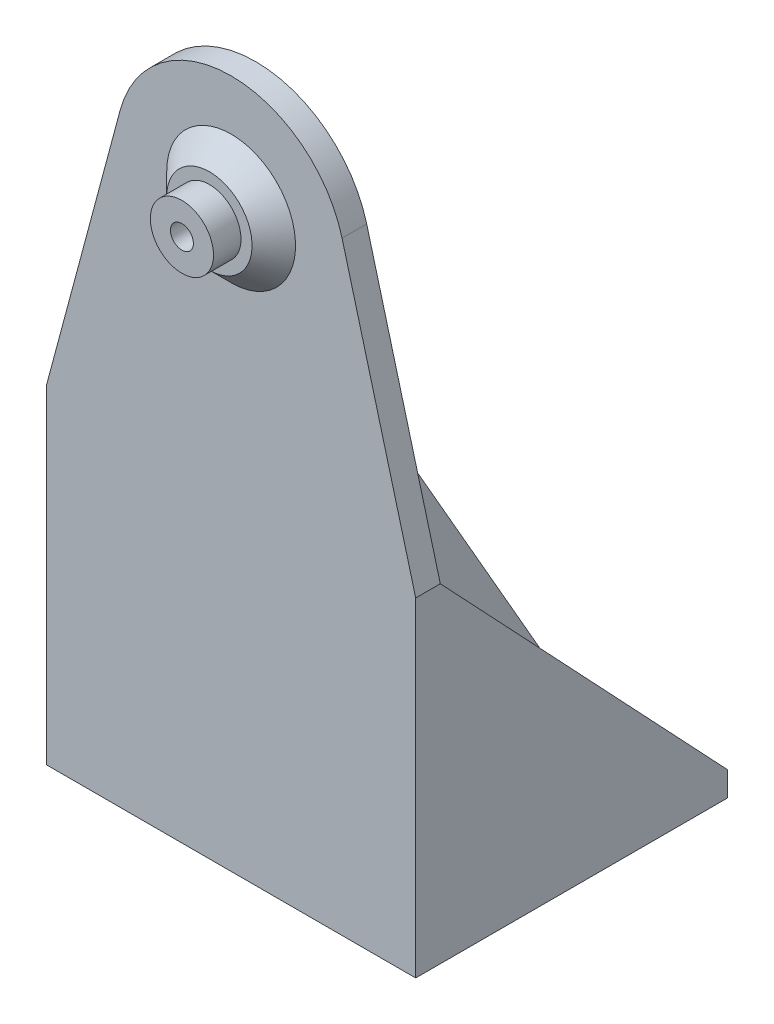
ISO-10303-21;
HEADER;
FILE_DESCRIPTION(('STEP AP214'),'2;1');
FILE_NAME('part.step','',(''),(''),'','','');
FILE_SCHEMA(('AUTOMOTIVE_DESIGN { 1 0 10303 214 1 1 1 1 }'));
ENDSEC;
DATA;
#1=APPLICATION_CONTEXT('core data for automotive mechanical design processes');
#2=APPLICATION_PROTOCOL_DEFINITION('international standard','automotive_design',2000,#1);
#3=PRODUCT_CONTEXT('',#1,'mechanical');
#4=PRODUCT('Part','Part','',(#3));
#5=PRODUCT_RELATED_PRODUCT_CATEGORY('part','',(#4));
#6=PRODUCT_DEFINITION_FORMATION('','',#4);
#7=PRODUCT_DEFINITION_CONTEXT('part definition',#1,'design');
#8=PRODUCT_DEFINITION('design','',#6,#7);
#9=PRODUCT_DEFINITION_SHAPE('','',#8);
#10=(LENGTH_UNIT() NAMED_UNIT(*) SI_UNIT(.MILLI.,.METRE.));
#11=(NAMED_UNIT(*) PLANE_ANGLE_UNIT() SI_UNIT($,.RADIAN.));
#12=(NAMED_UNIT(*) SI_UNIT($,.STERADIAN.) SOLID_ANGLE_UNIT());
#13=UNCERTAINTY_MEASURE_WITH_UNIT(LENGTH_MEASURE(1.E-05),#10,'distance_accuracy_value','');
#14=(GEOMETRIC_REPRESENTATION_CONTEXT(3) GLOBAL_UNCERTAINTY_ASSIGNED_CONTEXT((#13)) GLOBAL_UNIT_ASSIGNED_CONTEXT((#10,
#11,#12)) REPRESENTATION_CONTEXT('',''));
#15=CARTESIAN_POINT('',(0.,0.,0.));
#16=DIRECTION('',(0.,0.,1.));
#17=DIRECTION('',(1.,0.,0.));
#18=AXIS2_PLACEMENT_3D('',#15,#16,#17);
#19=CARTESIAN_POINT('',(22.4988060522023,-66.9948410242697,-44.));
#20=DIRECTION('',(0.,-1.,0.));
#21=DIRECTION('',(0.,0.,-1.));
#22=AXIS2_PLACEMENT_3D('',#19,#20,#21);
#23=PLANE('',#22);
#24=DIRECTION('',(0.,0.,1.));
#25=VECTOR('',#24,1.);
#26=CARTESIAN_POINT('',(14.0796860522023,-66.9948410242697,0.));
#27=LINE('',#26,#25);
#28=CARTESIAN_POINT('',(14.0796860522023,-66.9948410242697,-35.));
#29=VERTEX_POINT('',#28);
#30=CARTESIAN_POINT('',(14.0796860522023,-66.9948410242697,-19.));
#31=VERTEX_POINT('',#30);
#32=EDGE_CURVE('E253',#29,#31,#27,.T.);
#33=ORIENTED_EDGE('',*,*,#32,.T.);
#34=CARTESIAN_POINT('',(12.4813860522023,-66.9948410242697,-19.));
#35=DIRECTION('',(0.,1.,0.));
#36=DIRECTION('',(0.,0.,1.));
#37=AXIS2_PLACEMENT_3D('',#34,#35,#36);
#38=CIRCLE('',#37,1.5983);
#39=CARTESIAN_POINT('',(10.8830860522023,-66.9948410242697,-19.));
#40=VERTEX_POINT('',#39);
#41=EDGE_CURVE('E263',#40,#31,#38,.T.);
#42=ORIENTED_EDGE('',*,*,#41,.F.);
#43=DIRECTION('',(0.,0.,1.));
#44=VECTOR('',#43,1.);
#45=CARTESIAN_POINT('',(10.8830860522023,-66.9948410242697,0.));
#46=LINE('',#45,#44);
#47=CARTESIAN_POINT('',(10.8830860522023,-66.9948410242697,-35.));
#48=VERTEX_POINT('',#47);
#49=EDGE_CURVE('E260',#48,#40,#46,.T.);
#50=ORIENTED_EDGE('',*,*,#49,.F.);
#51=CARTESIAN_POINT('',(12.4813860522023,-66.9948410242697,-35.));
#52=DIRECTION('',(0.,1.,0.));
#53=DIRECTION('',(0.,0.,1.));
#54=AXIS2_PLACEMENT_3D('',#51,#52,#53);
#55=CIRCLE('',#54,1.5983);
#56=EDGE_CURVE('E256',#29,#48,#55,.T.);
#57=ORIENTED_EDGE('',*,*,#56,.F.);
#58=EDGE_LOOP('',(#33,#42,#50,#57));
#59=FACE_BOUND('',#58,.T.);
#60=DIRECTION('',(0.,0.,-1.));
#61=VECTOR('',#60,1.);
#62=CARTESIAN_POINT('',(1.49999999999999,-66.9948410242697,-9.));
#63=LINE('',#62,#61);
#64=CARTESIAN_POINT('',(1.49999999999999,-66.9948410242697,-9.));
#65=VERTEX_POINT('',#64);
#66=CARTESIAN_POINT('',(1.5,-66.9948410242697,-44.));
#67=VERTEX_POINT('',#66);
#68=EDGE_CURVE('E68',#65,#67,#63,.T.);
#69=ORIENTED_EDGE('',*,*,#68,.F.);
#70=DIRECTION('',(1.,0.,0.));
#71=VECTOR('',#70,1.);
#72=CARTESIAN_POINT('',(22.4988060522023,-66.9948410242697,-9.));
#73=LINE('',#72,#71);
#74=CARTESIAN_POINT('',(19.4988060522023,-66.9948410242697,-9.));
#75=VERTEX_POINT('',#74);
#76=EDGE_CURVE('E215',#65,#75,#73,.T.);
#77=ORIENTED_EDGE('',*,*,#76,.T.);
#78=DIRECTION('',(0.,0.,1.));
#79=VECTOR('',#78,1.);
#80=CARTESIAN_POINT('',(19.4988060522023,-66.9948410242697,-44.));
#81=LINE('',#80,#79);
#82=CARTESIAN_POINT('',(19.4988060522023,-66.9948410242697,-44.));
#83=VERTEX_POINT('',#82);
#84=EDGE_CURVE('E249',#83,#75,#81,.T.);
#85=ORIENTED_EDGE('',*,*,#84,.F.);
#86=DIRECTION('',(1.,0.,0.));
#87=VECTOR('',#86,1.);
#88=CARTESIAN_POINT('',(22.4988060522023,-66.9948410242697,-44.));
#89=LINE('',#88,#87);
#90=EDGE_CURVE('E324',#67,#83,#89,.T.);
#91=ORIENTED_EDGE('',*,*,#90,.F.);
#92=EDGE_LOOP('',(#69,#77,#85,#91));
#93=FACE_BOUND('',#92,.T.);
#94=ADVANCED_FACE('F53',(#59,#93),#23,.F.);
#95=CARTESIAN_POINT('',(-12.4813860522023,-66.9948410242697,-19.));
#96=DIRECTION('',(0.,1.,0.));
#97=DIRECTION('',(0.,0.,1.));
#98=AXIS2_PLACEMENT_3D('',#95,#96,#97);
#99=CIRCLE('',#98,1.5983);
#100=CARTESIAN_POINT('',(-10.8830860522023,-66.9948410242697,-19.));
#101=VERTEX_POINT('',#100);
#102=CARTESIAN_POINT('',(-14.0796860522023,-66.9948410242697,-19.));
#103=VERTEX_POINT('',#102);
#104=EDGE_CURVE('E252',#101,#103,#99,.F.);
#105=ORIENTED_EDGE('',*,*,#104,.T.);
#106=DIRECTION('',(0.,0.,1.));
#107=VECTOR('',#106,1.);
#108=CARTESIAN_POINT('',(-14.0796860522023,-66.9948410242697,0.));
#109=LINE('',#108,#107);
#110=CARTESIAN_POINT('',(-14.0796860522023,-66.9948410242697,-35.));
#111=VERTEX_POINT('',#110);
#112=EDGE_CURVE('E284',#111,#103,#109,.T.);
#113=ORIENTED_EDGE('',*,*,#112,.F.);
#114=CARTESIAN_POINT('',(-12.4813860522023,-66.9948410242697,-35.));
#115=DIRECTION('',(0.,1.,0.));
#116=DIRECTION('',(0.,0.,1.));
#117=AXIS2_PLACEMENT_3D('',#114,#115,#116);
#118=CIRCLE('',#117,1.5983);
#119=CARTESIAN_POINT('',(-10.8830860522023,-66.9948410242697,-35.));
#120=VERTEX_POINT('',#119);
#121=EDGE_CURVE('E281',#111,#120,#118,.F.);
#122=ORIENTED_EDGE('',*,*,#121,.T.);
#123=DIRECTION('',(0.,0.,1.));
#124=VECTOR('',#123,1.);
#125=CARTESIAN_POINT('',(-10.8830860522023,-66.9948410242697,0.));
#126=LINE('',#125,#124);
#127=EDGE_CURVE('E278',#120,#101,#126,.T.);
#128=ORIENTED_EDGE('',*,*,#127,.T.);
#129=EDGE_LOOP('',(#105,#113,#122,#128));
#130=FACE_BOUND('',#129,.T.);
#131=CARTESIAN_POINT('',(-19.4988060522023,-66.9948410242697,-9.));
#132=VERTEX_POINT('',#131);
#133=CARTESIAN_POINT('',(-1.50000000000001,-66.9948410242697,-9.));
#134=VERTEX_POINT('',#133);
#135=EDGE_CURVE('E319',#132,#134,#73,.T.);
#136=ORIENTED_EDGE('',*,*,#135,.T.);
#137=DIRECTION('',(0.,0.,-1.));
#138=VECTOR('',#137,1.);
#139=CARTESIAN_POINT('',(-1.50000000000001,-66.9948410242697,-9.));
#140=LINE('',#139,#138);
#141=CARTESIAN_POINT('',(-1.50000000000001,-66.9948410242697,-44.));
#142=VERTEX_POINT('',#141);
#143=EDGE_CURVE('E216',#134,#142,#140,.T.);
#144=ORIENTED_EDGE('',*,*,#143,.T.);
#145=CARTESIAN_POINT('',(-19.4988060522023,-66.9948410242697,-44.));
#146=VERTEX_POINT('',#145);
#147=EDGE_CURVE('E329',#146,#142,#89,.T.);
#148=ORIENTED_EDGE('',*,*,#147,.F.);
#149=DIRECTION('',(0.,0.,-1.));
#150=VECTOR('',#149,1.);
#151=CARTESIAN_POINT('',(-19.4988060522023,-66.9948410242697,-44.));
#152=LINE('',#151,#150);
#153=EDGE_CURVE('E234',#132,#146,#152,.T.);
#154=ORIENTED_EDGE('',*,*,#153,.F.);
#155=EDGE_LOOP('',(#136,#144,#148,#154));
#156=FACE_BOUND('',#155,.T.);
#157=ADVANCED_FACE('F457',(#130,#156),#23,.F.);
#158=CARTESIAN_POINT('',(0.,0.,-9.));
#159=DIRECTION('',(0.,0.,1.));
#160=DIRECTION('',(1.,0.,0.));
#161=AXIS2_PLACEMENT_3D('',#158,#159,#160);
#162=PLANE('',#161);
#163=CARTESIAN_POINT('',(0.,0.,-9.));
#164=DIRECTION('',(0.,0.,-1.));
#165=DIRECTION('',(-1.,0.,0.));
#166=AXIS2_PLACEMENT_3D('',#163,#164,#165);
#167=CIRCLE('',#166,1.4);
#168=CARTESIAN_POINT('',(-1.4,0.,-9.));
#169=VERTEX_POINT('',#168);
#170=EDGE_CURVE('E328',#169,#169,#167,.T.);
#171=ORIENTED_EDGE('',*,*,#170,.F.);
#172=EDGE_LOOP('',(#171));
#173=FACE_BOUND('',#172,.T.);
#174=DIRECTION('',(1.,0.,0.));
#175=VECTOR('',#174,1.);
#176=CARTESIAN_POINT('',(-1.5,-6.02147928252215,-9.));
#177=LINE('',#176,#175);
#178=CARTESIAN_POINT('',(-1.5,-6.02147928252215,-9.));
#179=VERTEX_POINT('',#178);
#180=CARTESIAN_POINT('',(1.5,-6.02147928252215,-9.));
#181=VERTEX_POINT('',#180);
#182=EDGE_CURVE('E196',#179,#181,#177,.T.);
#183=ORIENTED_EDGE('',*,*,#182,.F.);
#184=DIRECTION('',(0.,-1.,0.));
#185=VECTOR('',#184,1.);
#186=CARTESIAN_POINT('',(-1.5,-6.02147928252215,-9.));
#187=LINE('',#186,#185);
#188=EDGE_CURVE('E223',#179,#134,#187,.T.);
#189=ORIENTED_EDGE('',*,*,#188,.T.);
#190=ORIENTED_EDGE('',*,*,#135,.F.);
#191=DIRECTION('',(0.,-1.,0.));
#192=VECTOR('',#191,1.);
#193=CARTESIAN_POINT('',(-19.4988060522023,0.,-9.));
#194=LINE('',#193,#192);
#195=CARTESIAN_POINT('',(-19.4988060522023,-29.8748410242697,-9.));
#196=VERTEX_POINT('',#195);
#197=EDGE_CURVE('E232',#196,#132,#194,.T.);
#198=ORIENTED_EDGE('',*,*,#197,.F.);
#199=DIRECTION('',(-1.,0.,0.));
#200=VECTOR('',#199,1.);
#201=CARTESIAN_POINT('',(-19.4988060522023,-29.8748410242697,-9.));
#202=LINE('',#201,#200);
#203=CARTESIAN_POINT('',(-22.4988060522023,-29.8748410242697,-9.));
#204=VERTEX_POINT('',#203);
#205=EDGE_CURVE('E228',#196,#204,#202,.T.);
#206=ORIENTED_EDGE('',*,*,#205,.T.);
#207=DIRECTION('',(0.258819045102518,0.965925826289069,0.));
#208=VECTOR('',#207,1.);
#209=CARTESIAN_POINT('',(-13.522961568047,3.62346663143525,-9.));
#210=LINE('',#209,#208);
#211=CARTESIAN_POINT('',(-13.522961568047,3.62346663143525,-9.));
#212=VERTEX_POINT('',#211);
#213=EDGE_CURVE('E342',#204,#212,#210,.T.);
#214=ORIENTED_EDGE('',*,*,#213,.T.);
#215=CARTESIAN_POINT('',(0.,0.,-9.));
#216=DIRECTION('',(0.,0.,-1.));
#217=DIRECTION('',(1.,0.,0.));
#218=AXIS2_PLACEMENT_3D('',#215,#216,#217);
#219=CIRCLE('',#218,14.);
#220=CARTESIAN_POINT('',(13.522961568047,3.62346663143525,-9.));
#221=VERTEX_POINT('',#220);
#222=EDGE_CURVE('E335',#212,#221,#219,.T.);
#223=ORIENTED_EDGE('',*,*,#222,.T.);
#224=DIRECTION('',(0.258819045102518,-0.965925826289069,0.));
#225=VECTOR('',#224,1.);
#226=CARTESIAN_POINT('',(13.522961568047,3.62346663143525,-9.));
#227=LINE('',#226,#225);
#228=CARTESIAN_POINT('',(22.4988060522023,-29.8748410242697,-9.));
#229=VERTEX_POINT('',#228);
#230=EDGE_CURVE('E338',#221,#229,#227,.T.);
#231=ORIENTED_EDGE('',*,*,#230,.T.);
#232=DIRECTION('',(1.,0.,0.));
#233=VECTOR('',#232,1.);
#234=CARTESIAN_POINT('',(19.4988060522023,-29.8748410242697,-9.));
#235=LINE('',#234,#233);
#236=CARTESIAN_POINT('',(19.4988060522023,-29.8748410242697,-9.));
#237=VERTEX_POINT('',#236);
#238=EDGE_CURVE('E243',#237,#229,#235,.T.);
#239=ORIENTED_EDGE('',*,*,#238,.F.);
#240=DIRECTION('',(0.,1.,0.));
#241=VECTOR('',#240,1.);
#242=CARTESIAN_POINT('',(19.4988060522023,0.,-9.));
#243=LINE('',#242,#241);
#244=EDGE_CURVE('E245',#75,#237,#243,.T.);
#245=ORIENTED_EDGE('',*,*,#244,.F.);
#246=ORIENTED_EDGE('',*,*,#76,.F.);
#247=DIRECTION('',(0.,-1.,0.));
#248=VECTOR('',#247,1.);
#249=CARTESIAN_POINT('',(1.5,-6.02147928252215,-9.));
#250=LINE('',#249,#248);
#251=EDGE_CURVE('E210',#181,#65,#250,.T.);
#252=ORIENTED_EDGE('',*,*,#251,.F.);
#253=EDGE_LOOP('',(#183,#189,#190,#198,#206,#214,#223,#231,#239,#245,#246,#252));
#254=FACE_BOUND('',#253,.T.);
#255=ADVANCED_FACE('F213',(#173,#254),#162,.F.);
#256=CARTESIAN_POINT('',(22.4988060522023,-69.9948410242697,-9.));
#257=DIRECTION('',(0.,1.,0.));
#258=DIRECTION('',(0.,0.,1.));
#259=AXIS2_PLACEMENT_3D('',#256,#257,#258);
#260=PLANE('',#259);
#261=DIRECTION('',(0.,0.,1.));
#262=VECTOR('',#261,1.);
#263=CARTESIAN_POINT('',(-22.4988060522023,-69.9948410242697,-9.));
#264=LINE('',#263,#262);
#265=CARTESIAN_POINT('',(-22.4988060522023,-69.9948410242697,-44.));
#266=VERTEX_POINT('',#265);
#267=CARTESIAN_POINT('',(-22.4988060522023,-69.9948410242697,-6.));
#268=VERTEX_POINT('',#267);
#269=EDGE_CURVE('E361',#266,#268,#264,.T.);
#270=ORIENTED_EDGE('',*,*,#269,.F.);
#271=DIRECTION('',(-1.,0.,0.));
#272=VECTOR('',#271,1.);
#273=CARTESIAN_POINT('',(22.4988060522023,-69.9948410242697,-44.));
#274=LINE('',#273,#272);
#275=CARTESIAN_POINT('',(22.4988060522023,-69.9948410242697,-44.));
#276=VERTEX_POINT('',#275);
#277=EDGE_CURVE('E318',#276,#266,#274,.T.);
#278=ORIENTED_EDGE('',*,*,#277,.F.);
#279=DIRECTION('',(0.,0.,1.));
#280=VECTOR('',#279,1.);
#281=CARTESIAN_POINT('',(22.4988060522023,-69.9948410242697,-9.));
#282=LINE('',#281,#280);
#283=CARTESIAN_POINT('',(22.4988060522023,-69.9948410242697,-6.));
#284=VERTEX_POINT('',#283);
#285=EDGE_CURVE('E364',#276,#284,#282,.T.);
#286=ORIENTED_EDGE('',*,*,#285,.T.);
#287=DIRECTION('',(-1.,0.,0.));
#288=VECTOR('',#287,1.);
#289=CARTESIAN_POINT('',(22.4988060522023,-69.9948410242697,-6.));
#290=LINE('',#289,#288);
#291=EDGE_CURVE('E351',#284,#268,#290,.T.);
#292=ORIENTED_EDGE('',*,*,#291,.T.);
#293=EDGE_LOOP('',(#270,#278,#286,#292));
#294=FACE_BOUND('',#293,.T.);
#295=CARTESIAN_POINT('',(-12.4813860522023,-69.9948410242697,-19.));
#296=DIRECTION('',(0.,1.,0.));
#297=DIRECTION('',(0.,0.,1.));
#298=AXIS2_PLACEMENT_3D('',#295,#296,#297);
#299=CIRCLE('',#298,1.5983);
#300=CARTESIAN_POINT('',(-10.8830860522023,-69.9948410242697,-19.));
#301=VERTEX_POINT('',#300);
#302=CARTESIAN_POINT('',(-14.0796860522023,-69.9948410242697,-19.));
#303=VERTEX_POINT('',#302);
#304=EDGE_CURVE('E302',#301,#303,#299,.F.);
#305=ORIENTED_EDGE('',*,*,#304,.F.);
#306=DIRECTION('',(0.,0.,1.));
#307=VECTOR('',#306,1.);
#308=CARTESIAN_POINT('',(-10.8830860522023,-69.9948410242697,-9.));
#309=LINE('',#308,#307);
#310=CARTESIAN_POINT('',(-10.8830860522023,-69.9948410242697,-35.));
#311=VERTEX_POINT('',#310);
#312=EDGE_CURVE('E269',#311,#301,#309,.T.);
#313=ORIENTED_EDGE('',*,*,#312,.F.);
#314=CARTESIAN_POINT('',(-12.4813860522023,-69.9948410242697,-35.));
#315=DIRECTION('',(0.,1.,0.));
#316=DIRECTION('',(0.,0.,1.));
#317=AXIS2_PLACEMENT_3D('',#314,#315,#316);
#318=CIRCLE('',#317,1.5983);
#319=CARTESIAN_POINT('',(-14.0796860522023,-69.9948410242697,-35.));
#320=VERTEX_POINT('',#319);
#321=EDGE_CURVE('E296',#320,#311,#318,.F.);
#322=ORIENTED_EDGE('',*,*,#321,.F.);
#323=DIRECTION('',(0.,0.,1.));
#324=VECTOR('',#323,1.);
#325=CARTESIAN_POINT('',(-14.0796860522023,-69.9948410242697,-8.99999999999999));
#326=LINE('',#325,#324);
#327=EDGE_CURVE('E299',#320,#303,#326,.T.);
#328=ORIENTED_EDGE('',*,*,#327,.T.);
#329=EDGE_LOOP('',(#305,#313,#322,#328));
#330=FACE_BOUND('',#329,.T.);
#331=DIRECTION('',(0.,0.,1.));
#332=VECTOR('',#331,1.);
#333=CARTESIAN_POINT('',(14.0796860522023,-69.9948410242697,-9.00000000000001));
#334=LINE('',#333,#332);
#335=CARTESIAN_POINT('',(14.0796860522023,-69.9948410242697,-35.));
#336=VERTEX_POINT('',#335);
#337=CARTESIAN_POINT('',(14.0796860522023,-69.9948410242697,-19.));
#338=VERTEX_POINT('',#337);
#339=EDGE_CURVE('E313',#336,#338,#334,.T.);
#340=ORIENTED_EDGE('',*,*,#339,.F.);
#341=CARTESIAN_POINT('',(12.4813860522023,-69.9948410242697,-35.));
#342=DIRECTION('',(0.,1.,0.));
#343=DIRECTION('',(0.,0.,1.));
#344=AXIS2_PLACEMENT_3D('',#341,#342,#343);
#345=CIRCLE('',#344,1.5983);
#346=CARTESIAN_POINT('',(10.8830860522023,-69.9948410242697,-35.));
#347=VERTEX_POINT('',#346);
#348=EDGE_CURVE('E304',#336,#347,#345,.T.);
#349=ORIENTED_EDGE('',*,*,#348,.T.);
#350=DIRECTION('',(0.,0.,1.));
#351=VECTOR('',#350,1.);
#352=CARTESIAN_POINT('',(10.8830860522023,-69.9948410242697,-9.00000000000001));
#353=LINE('',#352,#351);
#354=CARTESIAN_POINT('',(10.8830860522023,-69.9948410242697,-19.));
#355=VERTEX_POINT('',#354);
#356=EDGE_CURVE('E307',#347,#355,#353,.T.);
#357=ORIENTED_EDGE('',*,*,#356,.T.);
#358=CARTESIAN_POINT('',(12.4813860522023,-69.9948410242697,-19.));
#359=DIRECTION('',(0.,1.,0.));
#360=DIRECTION('',(0.,0.,1.));
#361=AXIS2_PLACEMENT_3D('',#358,#359,#360);
#362=CIRCLE('',#361,1.5983);
#363=EDGE_CURVE('E310',#355,#338,#362,.T.);
#364=ORIENTED_EDGE('',*,*,#363,.T.);
#365=EDGE_LOOP('',(#340,#349,#357,#364));
#366=FACE_BOUND('',#365,.T.);
#367=ADVANCED_FACE('F405',(#294,#330,#366),#260,.F.);
#368=CARTESIAN_POINT('',(0.,0.,-3.35));
#369=DIRECTION('',(0.,0.,1.));
#370=DIRECTION('',(1.,0.,0.));
#371=AXIS2_PLACEMENT_3D('',#368,#369,#370);
#372=CYLINDRICAL_SURFACE('',#371,3.85);
#373=CARTESIAN_POINT('',(0.,0.,-3.35));
#374=DIRECTION('',(0.,0.,1.));
#375=DIRECTION('',(1.,0.,0.));
#376=AXIS2_PLACEMENT_3D('',#373,#374,#375);
#377=CIRCLE('',#376,3.85);
#378=CARTESIAN_POINT('',(3.85,0.,-3.35));
#379=VERTEX_POINT('',#378);
#380=EDGE_CURVE('E442',#379,#379,#377,.T.);
#381=ORIENTED_EDGE('',*,*,#380,.T.);
#382=EDGE_LOOP('',(#381));
#383=FACE_BOUND('',#382,.T.);
#384=CARTESIAN_POINT('',(0.,0.,0.));
#385=DIRECTION('',(0.,0.,1.));
#386=DIRECTION('',(1.,0.,0.));
#387=AXIS2_PLACEMENT_3D('',#384,#385,#386);
#388=CIRCLE('',#387,3.85);
#389=CARTESIAN_POINT('',(3.85,0.,0.));
#390=VERTEX_POINT('',#389);
#391=EDGE_CURVE('E12',#390,#390,#388,.T.);
#392=ORIENTED_EDGE('',*,*,#391,.F.);
#393=EDGE_LOOP('',(#392));
#394=FACE_BOUND('',#393,.T.);
#395=ADVANCED_FACE('F55',(#383,#394),#372,.T.);
#396=CARTESIAN_POINT('',(0.,0.,0.));
#397=DIRECTION('',(0.,0.,1.));
#398=DIRECTION('',(1.,0.,0.));
#399=AXIS2_PLACEMENT_3D('',#396,#397,#398);
#400=PLANE('',#399);
#401=CARTESIAN_POINT('',(0.,0.,0.));
#402=DIRECTION('',(0.,0.,1.));
#403=DIRECTION('',(1.,0.,0.));
#404=AXIS2_PLACEMENT_3D('',#401,#402,#403);
#405=CIRCLE('',#404,1.4);
#406=CARTESIAN_POINT('',(1.4,0.,0.));
#407=VERTEX_POINT('',#406);
#408=EDGE_CURVE('E61',#407,#407,#405,.T.);
#409=ORIENTED_EDGE('',*,*,#408,.F.);
#410=EDGE_LOOP('',(#409));
#411=FACE_BOUND('',#410,.T.);
#412=ORIENTED_EDGE('',*,*,#391,.T.);
#413=EDGE_LOOP('',(#412));
#414=FACE_BOUND('',#413,.T.);
#415=ADVANCED_FACE('F637',(#411,#414),#400,.T.);
#416=CARTESIAN_POINT('',(0.,0.,-3.35));
#417=DIRECTION('',(0.,0.,1.));
#418=DIRECTION('',(1.,0.,0.));
#419=AXIS2_PLACEMENT_3D('',#416,#417,#418);
#420=CYLINDRICAL_SURFACE('',#419,1.4);
#421=ORIENTED_EDGE('',*,*,#408,.T.);
#422=EDGE_LOOP('',(#421));
#423=FACE_BOUND('',#422,.T.);
#424=ORIENTED_EDGE('',*,*,#170,.T.);
#425=EDGE_LOOP('',(#424));
#426=FACE_BOUND('',#425,.T.);
#427=ADVANCED_FACE('F425',(#423,#426),#420,.F.);
#428=CARTESIAN_POINT('',(0.,0.,-3.35));
#429=DIRECTION('',(0.,0.,-1.));
#430=DIRECTION('',(-1.,0.,0.));
#431=AXIS2_PLACEMENT_3D('',#428,#429,#430);
#432=CONICAL_SURFACE('',#431,5.2,0.785398163397448);
#433=CARTESIAN_POINT('',(0.,0.,-6.));
#434=DIRECTION('',(0.,0.,-1.));
#435=DIRECTION('',(-1.,0.,0.));
#436=AXIS2_PLACEMENT_3D('',#433,#434,#435);
#437=CIRCLE('',#436,7.85);
#438=CARTESIAN_POINT('',(-7.85,0.,-6.));
#439=VERTEX_POINT('',#438);
#440=EDGE_CURVE('E373',#439,#439,#437,.T.);
#441=ORIENTED_EDGE('',*,*,#440,.F.);
#442=EDGE_LOOP('',(#441));
#443=FACE_BOUND('',#442,.T.);
#444=CARTESIAN_POINT('',(0.,0.,-3.35));
#445=DIRECTION('',(0.,0.,-1.));
#446=DIRECTION('',(-1.,0.,0.));
#447=AXIS2_PLACEMENT_3D('',#444,#445,#446);
#448=CIRCLE('',#447,5.2);
#449=CARTESIAN_POINT('',(-5.2,0.,-3.35));
#450=VERTEX_POINT('',#449);
#451=EDGE_CURVE('E437',#450,#450,#448,.T.);
#452=ORIENTED_EDGE('',*,*,#451,.T.);
#453=EDGE_LOOP('',(#452));
#454=FACE_BOUND('',#453,.T.);
#455=ADVANCED_FACE('F421',(#443,#454),#432,.T.);
#456=CARTESIAN_POINT('',(0.,0.,-3.35));
#457=DIRECTION('',(0.,0.,-1.));
#458=DIRECTION('',(-1.,0.,0.));
#459=AXIS2_PLACEMENT_3D('',#456,#457,#458);
#460=PLANE('',#459);
#461=ORIENTED_EDGE('',*,*,#380,.F.);
#462=EDGE_LOOP('',(#461));
#463=FACE_BOUND('',#462,.T.);
#464=ORIENTED_EDGE('',*,*,#451,.F.);
#465=EDGE_LOOP('',(#464));
#466=FACE_BOUND('',#465,.T.);
#467=ADVANCED_FACE('F419',(#463,#466),#460,.F.);
#468=CARTESIAN_POINT('',(0.,0.,-9.));
#469=DIRECTION('',(0.,0.,1.));
#470=DIRECTION('',(1.,0.,0.));
#471=AXIS2_PLACEMENT_3D('',#468,#469,#470);
#472=CYLINDRICAL_SURFACE('',#471,14.);
#473=CARTESIAN_POINT('',(0.,0.,-6.));
#474=DIRECTION('',(0.,0.,-1.));
#475=DIRECTION('',(1.,0.,0.));
#476=AXIS2_PLACEMENT_3D('',#473,#474,#475);
#477=CIRCLE('',#476,14.);
#478=CARTESIAN_POINT('',(-13.522961568047,3.62346663143525,-6.));
#479=VERTEX_POINT('',#478);
#480=CARTESIAN_POINT('',(13.522961568047,3.62346663143525,-6.));
#481=VERTEX_POINT('',#480);
#482=EDGE_CURVE('E334',#479,#481,#477,.T.);
#483=ORIENTED_EDGE('',*,*,#482,.T.);
#484=DIRECTION('',(0.,0.,1.));
#485=VECTOR('',#484,1.);
#486=CARTESIAN_POINT('',(13.522961568047,3.62346663143525,-9.));
#487=LINE('',#486,#485);
#488=EDGE_CURVE('E370',#221,#481,#487,.T.);
#489=ORIENTED_EDGE('',*,*,#488,.F.);
#490=ORIENTED_EDGE('',*,*,#222,.F.);
#491=DIRECTION('',(0.,0.,1.));
#492=VECTOR('',#491,1.);
#493=CARTESIAN_POINT('',(-13.522961568047,3.62346663143525,-9.));
#494=LINE('',#493,#492);
#495=EDGE_CURVE('E344',#212,#479,#494,.T.);
#496=ORIENTED_EDGE('',*,*,#495,.T.);
#497=EDGE_LOOP('',(#483,#489,#490,#496));
#498=FACE_BOUND('',#497,.T.);
#499=ADVANCED_FACE('F415',(#498),#472,.T.);
#500=CARTESIAN_POINT('',(13.522961568047,3.62346663143525,-9.));
#501=DIRECTION('',(-0.965925826289069,-0.258819045102518,0.));
#502=DIRECTION('',(0.258819045102518,-0.965925826289069,0.));
#503=AXIS2_PLACEMENT_3D('',#500,#501,#502);
#504=PLANE('',#503);
#505=DIRECTION('',(0.258819045102518,-0.965925826289069,0.));
#506=VECTOR('',#505,1.);
#507=CARTESIAN_POINT('',(13.522961568047,3.62346663143525,-6.));
#508=LINE('',#507,#506);
#509=CARTESIAN_POINT('',(22.4988060522023,-29.8748410242697,-6.));
#510=VERTEX_POINT('',#509);
#511=EDGE_CURVE('E347',#481,#510,#508,.T.);
#512=ORIENTED_EDGE('',*,*,#511,.T.);
#513=DIRECTION('',(0.,0.,1.));
#514=VECTOR('',#513,1.);
#515=CARTESIAN_POINT('',(22.4988060522023,-29.8748410242697,-9.));
#516=LINE('',#515,#514);
#517=EDGE_CURVE('E367',#229,#510,#516,.T.);
#518=ORIENTED_EDGE('',*,*,#517,.F.);
#519=ORIENTED_EDGE('',*,*,#230,.F.);
#520=ORIENTED_EDGE('',*,*,#488,.T.);
#521=EDGE_LOOP('',(#512,#518,#519,#520));
#522=FACE_BOUND('',#521,.T.);
#523=ADVANCED_FACE('F411',(#522),#504,.F.);
#524=CARTESIAN_POINT('',(22.4988060522023,-29.8748410242697,-9.));
#525=DIRECTION('',(-1.,0.,0.));
#526=DIRECTION('',(0.,-1.,0.));
#527=AXIS2_PLACEMENT_3D('',#524,#525,#526);
#528=PLANE('',#527);
#529=DIRECTION('',(0.,-1.,0.));
#530=VECTOR('',#529,1.);
#531=CARTESIAN_POINT('',(22.4988060522023,-29.8748410242697,-6.));
#532=LINE('',#531,#530);
#533=EDGE_CURVE('E349',#510,#284,#532,.T.);
#534=ORIENTED_EDGE('',*,*,#533,.T.);
#535=ORIENTED_EDGE('',*,*,#285,.F.);
#536=DIRECTION('',(0.,-1.,0.));
#537=VECTOR('',#536,1.);
#538=CARTESIAN_POINT('',(22.4988060522023,-66.9948410242697,-44.));
#539=LINE('',#538,#537);
#540=CARTESIAN_POINT('',(22.4988060522023,-66.9948410242697,-44.));
#541=VERTEX_POINT('',#540);
#542=EDGE_CURVE('E315',#541,#276,#539,.T.);
#543=ORIENTED_EDGE('',*,*,#542,.F.);
#544=DIRECTION('',(0.,0.727578225046068,0.686024727279428));
#545=VECTOR('',#544,1.);
#546=CARTESIAN_POINT('',(22.4988060522023,-29.8748410242697,-9.));
#547=LINE('',#546,#545);
#548=EDGE_CURVE('E236',#541,#229,#547,.T.);
#549=ORIENTED_EDGE('',*,*,#548,.T.);
#550=ORIENTED_EDGE('',*,*,#517,.T.);
#551=EDGE_LOOP('',(#534,#535,#543,#549,#550));
#552=FACE_BOUND('',#551,.T.);
#553=ADVANCED_FACE('F403',(#552),#528,.F.);
#554=CARTESIAN_POINT('',(-22.4988060522023,-29.8748410242697,-9.));
#555=DIRECTION('',(1.,0.,0.));
#556=DIRECTION('',(0.,1.,0.));
#557=AXIS2_PLACEMENT_3D('',#554,#555,#556);
#558=PLANE('',#557);
#559=DIRECTION('',(0.,1.,0.));
#560=VECTOR('',#559,1.);
#561=CARTESIAN_POINT('',(-22.4988060522023,-29.8748410242697,-6.));
#562=LINE('',#561,#560);
#563=CARTESIAN_POINT('',(-22.4988060522023,-29.8748410242697,-6.));
#564=VERTEX_POINT('',#563);
#565=EDGE_CURVE('E353',#268,#564,#562,.T.);
#566=ORIENTED_EDGE('',*,*,#565,.T.);
#567=DIRECTION('',(0.,0.,1.));
#568=VECTOR('',#567,1.);
#569=CARTESIAN_POINT('',(-22.4988060522023,-29.8748410242697,-9.));
#570=LINE('',#569,#568);
#571=EDGE_CURVE('E358',#204,#564,#570,.T.);
#572=ORIENTED_EDGE('',*,*,#571,.F.);
#573=DIRECTION('',(0.,0.727578225046068,0.686024727279428));
#574=VECTOR('',#573,1.);
#575=CARTESIAN_POINT('',(-22.4988060522023,-29.8748410242697,-9.));
#576=LINE('',#575,#574);
#577=CARTESIAN_POINT('',(-22.4988060522023,-66.9948410242697,-44.));
#578=VERTEX_POINT('',#577);
#579=EDGE_CURVE('E206',#578,#204,#576,.T.);
#580=ORIENTED_EDGE('',*,*,#579,.F.);
#581=DIRECTION('',(0.,1.,0.));
#582=VECTOR('',#581,1.);
#583=CARTESIAN_POINT('',(-22.4988060522023,-69.9948410242697,-44.));
#584=LINE('',#583,#582);
#585=EDGE_CURVE('E321',#266,#578,#584,.T.);
#586=ORIENTED_EDGE('',*,*,#585,.F.);
#587=ORIENTED_EDGE('',*,*,#269,.T.);
#588=EDGE_LOOP('',(#566,#572,#580,#586,#587));
#589=FACE_BOUND('',#588,.T.);
#590=ADVANCED_FACE('F399',(#589),#558,.F.);
#591=CARTESIAN_POINT('',(-13.522961568047,3.62346663143525,-9.));
#592=DIRECTION('',(0.965925826289069,-0.258819045102518,0.));
#593=DIRECTION('',(0.258819045102518,0.965925826289069,0.));
#594=AXIS2_PLACEMENT_3D('',#591,#592,#593);
#595=PLANE('',#594);
#596=DIRECTION('',(0.258819045102518,0.965925826289069,0.));
#597=VECTOR('',#596,1.);
#598=CARTESIAN_POINT('',(-13.522961568047,3.62346663143525,-6.));
#599=LINE('',#598,#597);
#600=EDGE_CURVE('E339',#564,#479,#599,.T.);
#601=ORIENTED_EDGE('',*,*,#600,.T.);
#602=ORIENTED_EDGE('',*,*,#495,.F.);
#603=ORIENTED_EDGE('',*,*,#213,.F.);
#604=ORIENTED_EDGE('',*,*,#571,.T.);
#605=EDGE_LOOP('',(#601,#602,#603,#604));
#606=FACE_BOUND('',#605,.T.);
#607=ADVANCED_FACE('F394',(#606),#595,.F.);
#608=CARTESIAN_POINT('',(0.,0.,-6.));
#609=DIRECTION('',(0.,0.,1.));
#610=DIRECTION('',(1.,0.,0.));
#611=AXIS2_PLACEMENT_3D('',#608,#609,#610);
#612=PLANE('',#611);
#613=ORIENTED_EDGE('',*,*,#600,.F.);
#614=ORIENTED_EDGE('',*,*,#565,.F.);
#615=ORIENTED_EDGE('',*,*,#291,.F.);
#616=ORIENTED_EDGE('',*,*,#533,.F.);
#617=ORIENTED_EDGE('',*,*,#511,.F.);
#618=ORIENTED_EDGE('',*,*,#482,.F.);
#619=EDGE_LOOP('',(#613,#614,#615,#616,#617,#618));
#620=FACE_BOUND('',#619,.T.);
#621=ORIENTED_EDGE('',*,*,#440,.T.);
#622=EDGE_LOOP('',(#621));
#623=FACE_BOUND('',#622,.T.);
#624=ADVANCED_FACE('F383',(#620,#623),#612,.T.);
#625=CARTESIAN_POINT('',(0.,0.,-44.));
#626=DIRECTION('',(0.,0.,-1.));
#627=DIRECTION('',(-1.,0.,0.));
#628=AXIS2_PLACEMENT_3D('',#625,#626,#627);
#629=PLANE('',#628);
#630=EDGE_CURVE('E325',#578,#146,#89,.T.);
#631=ORIENTED_EDGE('',*,*,#630,.T.);
#632=ORIENTED_EDGE('',*,*,#147,.T.);
#633=DIRECTION('',(1.,0.,0.));
#634=VECTOR('',#633,1.);
#635=CARTESIAN_POINT('',(-1.50000000000001,-66.9948410242697,-44.));
#636=LINE('',#635,#634);
#637=EDGE_CURVE('E207',#142,#67,#636,.T.);
#638=ORIENTED_EDGE('',*,*,#637,.T.);
#639=ORIENTED_EDGE('',*,*,#90,.T.);
#640=DIRECTION('',(1.,0.,0.));
#641=VECTOR('',#640,1.);
#642=CARTESIAN_POINT('',(19.4988060522023,-66.9948410242697,-44.));
#643=LINE('',#642,#641);
#644=EDGE_CURVE('E240',#83,#541,#643,.T.);
#645=ORIENTED_EDGE('',*,*,#644,.T.);
#646=ORIENTED_EDGE('',*,*,#542,.T.);
#647=ORIENTED_EDGE('',*,*,#277,.T.);
#648=ORIENTED_EDGE('',*,*,#585,.T.);
#649=EDGE_LOOP('',(#631,#632,#638,#639,#645,#646,#647,#648));
#650=FACE_BOUND('',#649,.T.);
#651=ADVANCED_FACE('F393',(#650),#629,.T.);
#652=CARTESIAN_POINT('',(-12.4813860522023,-101.99484102427,-19.));
#653=DIRECTION('',(0.,1.,0.));
#654=DIRECTION('',(0.,0.,1.));
#655=AXIS2_PLACEMENT_3D('',#652,#653,#654);
#656=CYLINDRICAL_SURFACE('',#655,1.5983);
#657=ORIENTED_EDGE('',*,*,#304,.T.);
#658=DIRECTION('',(0.,1.,0.));
#659=VECTOR('',#658,1.);
#660=CARTESIAN_POINT('',(-14.0796860522023,-101.99484102427,-19.));
#661=LINE('',#660,#659);
#662=EDGE_CURVE('E257',#303,#103,#661,.T.);
#663=ORIENTED_EDGE('',*,*,#662,.T.);
#664=ORIENTED_EDGE('',*,*,#104,.F.);
#665=DIRECTION('',(0.,1.,0.));
#666=VECTOR('',#665,1.);
#667=CARTESIAN_POINT('',(-10.8830860522023,-101.99484102427,-19.));
#668=LINE('',#667,#666);
#669=EDGE_CURVE('E287',#301,#101,#668,.T.);
#670=ORIENTED_EDGE('',*,*,#669,.F.);
#671=EDGE_LOOP('',(#657,#663,#664,#670));
#672=FACE_BOUND('',#671,.T.);
#673=ADVANCED_FACE('F468',(#672),#656,.F.);
#674=CARTESIAN_POINT('',(-14.0796860522023,-101.99484102427,0.));
#675=DIRECTION('',(-1.,0.,0.));
#676=DIRECTION('',(0.,0.,1.));
#677=AXIS2_PLACEMENT_3D('',#674,#675,#676);
#678=PLANE('',#677);
#679=DIRECTION('',(0.,1.,0.));
#680=VECTOR('',#679,1.);
#681=CARTESIAN_POINT('',(-14.0796860522023,-101.99484102427,-35.));
#682=LINE('',#681,#680);
#683=EDGE_CURVE('E289',#320,#111,#682,.T.);
#684=ORIENTED_EDGE('',*,*,#683,.T.);
#685=ORIENTED_EDGE('',*,*,#112,.T.);
#686=ORIENTED_EDGE('',*,*,#662,.F.);
#687=ORIENTED_EDGE('',*,*,#327,.F.);
#688=EDGE_LOOP('',(#684,#685,#686,#687));
#689=FACE_BOUND('',#688,.T.);
#690=ADVANCED_FACE('F472',(#689),#678,.F.);
#691=CARTESIAN_POINT('',(-12.4813860522023,-101.99484102427,-35.));
#692=DIRECTION('',(0.,1.,0.));
#693=DIRECTION('',(0.,0.,1.));
#694=AXIS2_PLACEMENT_3D('',#691,#692,#693);
#695=CYLINDRICAL_SURFACE('',#694,1.5983);
#696=ORIENTED_EDGE('',*,*,#321,.T.);
#697=DIRECTION('',(0.,1.,0.));
#698=VECTOR('',#697,1.);
#699=CARTESIAN_POINT('',(-10.8830860522023,-101.99484102427,-35.));
#700=LINE('',#699,#698);
#701=EDGE_CURVE('E291',#311,#120,#700,.T.);
#702=ORIENTED_EDGE('',*,*,#701,.T.);
#703=ORIENTED_EDGE('',*,*,#121,.F.);
#704=ORIENTED_EDGE('',*,*,#683,.F.);
#705=EDGE_LOOP('',(#696,#702,#703,#704));
#706=FACE_BOUND('',#705,.T.);
#707=ADVANCED_FACE('F478',(#706),#695,.F.);
#708=CARTESIAN_POINT('',(-10.8830860522023,-101.99484102427,0.));
#709=DIRECTION('',(-1.,0.,0.));
#710=DIRECTION('',(0.,0.,1.));
#711=AXIS2_PLACEMENT_3D('',#708,#709,#710);
#712=PLANE('',#711);
#713=ORIENTED_EDGE('',*,*,#312,.T.);
#714=ORIENTED_EDGE('',*,*,#669,.T.);
#715=ORIENTED_EDGE('',*,*,#127,.F.);
#716=ORIENTED_EDGE('',*,*,#701,.F.);
#717=EDGE_LOOP('',(#713,#714,#715,#716));
#718=FACE_BOUND('',#717,.T.);
#719=ADVANCED_FACE('F474',(#718),#712,.T.);
#720=CARTESIAN_POINT('',(14.0796860522023,-101.99484102427,0.));
#721=DIRECTION('',(-1.,0.,0.));
#722=DIRECTION('',(0.,0.,1.));
#723=AXIS2_PLACEMENT_3D('',#720,#721,#722);
#724=PLANE('',#723);
#725=ORIENTED_EDGE('',*,*,#339,.T.);
#726=DIRECTION('',(0.,1.,0.));
#727=VECTOR('',#726,1.);
#728=CARTESIAN_POINT('',(14.0796860522023,-101.99484102427,-19.));
#729=LINE('',#728,#727);
#730=EDGE_CURVE('E267',#338,#31,#729,.T.);
#731=ORIENTED_EDGE('',*,*,#730,.T.);
#732=ORIENTED_EDGE('',*,*,#32,.F.);
#733=DIRECTION('',(0.,1.,0.));
#734=VECTOR('',#733,1.);
#735=CARTESIAN_POINT('',(14.0796860522023,-101.99484102427,-35.));
#736=LINE('',#735,#734);
#737=EDGE_CURVE('E266',#336,#29,#736,.T.);
#738=ORIENTED_EDGE('',*,*,#737,.F.);
#739=EDGE_LOOP('',(#725,#731,#732,#738));
#740=FACE_BOUND('',#739,.T.);
#741=ADVANCED_FACE('F477',(#740),#724,.T.);
#742=CARTESIAN_POINT('',(12.4813860522023,-101.99484102427,-19.));
#743=DIRECTION('',(0.,1.,0.));
#744=DIRECTION('',(0.,0.,1.));
#745=AXIS2_PLACEMENT_3D('',#742,#743,#744);
#746=CYLINDRICAL_SURFACE('',#745,1.5983);
#747=DIRECTION('',(0.,1.,0.));
#748=VECTOR('',#747,1.);
#749=CARTESIAN_POINT('',(10.8830860522023,-101.99484102427,-19.));
#750=LINE('',#749,#748);
#751=EDGE_CURVE('E270',#355,#40,#750,.T.);
#752=ORIENTED_EDGE('',*,*,#751,.T.);
#753=ORIENTED_EDGE('',*,*,#41,.T.);
#754=ORIENTED_EDGE('',*,*,#730,.F.);
#755=ORIENTED_EDGE('',*,*,#363,.F.);
#756=EDGE_LOOP('',(#752,#753,#754,#755));
#757=FACE_BOUND('',#756,.T.);
#758=ADVANCED_FACE('F488',(#757),#746,.F.);
#759=CARTESIAN_POINT('',(10.8830860522023,-101.99484102427,0.));
#760=DIRECTION('',(-1.,0.,0.));
#761=DIRECTION('',(0.,0.,1.));
#762=AXIS2_PLACEMENT_3D('',#759,#760,#761);
#763=PLANE('',#762);
#764=DIRECTION('',(0.,1.,0.));
#765=VECTOR('',#764,1.);
#766=CARTESIAN_POINT('',(10.8830860522023,-101.99484102427,-35.));
#767=LINE('',#766,#765);
#768=EDGE_CURVE('E272',#347,#48,#767,.T.);
#769=ORIENTED_EDGE('',*,*,#768,.T.);
#770=ORIENTED_EDGE('',*,*,#49,.T.);
#771=ORIENTED_EDGE('',*,*,#751,.F.);
#772=ORIENTED_EDGE('',*,*,#356,.F.);
#773=EDGE_LOOP('',(#769,#770,#771,#772));
#774=FACE_BOUND('',#773,.T.);
#775=ADVANCED_FACE('F494',(#774),#763,.F.);
#776=CARTESIAN_POINT('',(12.4813860522023,-101.99484102427,-35.));
#777=DIRECTION('',(0.,1.,0.));
#778=DIRECTION('',(0.,0.,1.));
#779=AXIS2_PLACEMENT_3D('',#776,#777,#778);
#780=CYLINDRICAL_SURFACE('',#779,1.5983);
#781=ORIENTED_EDGE('',*,*,#737,.T.);
#782=ORIENTED_EDGE('',*,*,#56,.T.);
#783=ORIENTED_EDGE('',*,*,#768,.F.);
#784=ORIENTED_EDGE('',*,*,#348,.F.);
#785=EDGE_LOOP('',(#781,#782,#783,#784));
#786=FACE_BOUND('',#785,.T.);
#787=ADVANCED_FACE('F490',(#786),#780,.F.);
#788=CARTESIAN_POINT('',(19.4988060522023,0.,0.));
#789=DIRECTION('',(1.,0.,0.));
#790=DIRECTION('',(0.,1.,0.));
#791=AXIS2_PLACEMENT_3D('',#788,#789,#790);
#792=PLANE('',#791);
#793=DIRECTION('',(0.,0.727578225046068,0.686024727279428));
#794=VECTOR('',#793,1.);
#795=CARTESIAN_POINT('',(19.4988060522023,-29.8748410242697,-9.));
#796=LINE('',#795,#794);
#797=EDGE_CURVE('E237',#83,#237,#796,.T.);
#798=ORIENTED_EDGE('',*,*,#797,.F.);
#799=ORIENTED_EDGE('',*,*,#84,.T.);
#800=ORIENTED_EDGE('',*,*,#244,.T.);
#801=EDGE_LOOP('',(#798,#799,#800));
#802=FACE_BOUND('',#801,.T.);
#803=ADVANCED_FACE('F493',(#802),#792,.F.);
#804=CARTESIAN_POINT('',(19.4988060522023,-29.8748410242697,-9.));
#805=DIRECTION('',(0.,0.686024727279428,-0.727578225046068));
#806=DIRECTION('',(0.,0.727578225046068,0.686024727279428));
#807=AXIS2_PLACEMENT_3D('',#804,#805,#806);
#808=PLANE('',#807);
#809=ORIENTED_EDGE('',*,*,#548,.F.);
#810=ORIENTED_EDGE('',*,*,#644,.F.);
#811=ORIENTED_EDGE('',*,*,#797,.T.);
#812=ORIENTED_EDGE('',*,*,#238,.T.);
#813=EDGE_LOOP('',(#809,#810,#811,#812));
#814=FACE_BOUND('',#813,.T.);
#815=ADVANCED_FACE('F502',(#814),#808,.T.);
#816=CARTESIAN_POINT('',(-19.4988060522023,0.,0.));
#817=DIRECTION('',(-1.,0.,0.));
#818=DIRECTION('',(0.,1.,0.));
#819=AXIS2_PLACEMENT_3D('',#816,#817,#818);
#820=PLANE('',#819);
#821=ORIENTED_EDGE('',*,*,#197,.T.);
#822=ORIENTED_EDGE('',*,*,#153,.T.);
#823=DIRECTION('',(0.,0.727578225046068,0.686024727279428));
#824=VECTOR('',#823,1.);
#825=CARTESIAN_POINT('',(-19.4988060522023,-29.8748410242697,-9.));
#826=LINE('',#825,#824);
#827=EDGE_CURVE('E76',#146,#196,#826,.T.);
#828=ORIENTED_EDGE('',*,*,#827,.T.);
#829=EDGE_LOOP('',(#821,#822,#828));
#830=FACE_BOUND('',#829,.T.);
#831=ADVANCED_FACE('F505',(#830),#820,.F.);
#832=CARTESIAN_POINT('',(-19.4988060522023,-29.8748410242697,-9.));
#833=DIRECTION('',(0.,-0.686024727279428,0.727578225046068));
#834=DIRECTION('',(0.,-0.727578225046068,-0.686024727279428));
#835=AXIS2_PLACEMENT_3D('',#832,#833,#834);
#836=PLANE('',#835);
#837=ORIENTED_EDGE('',*,*,#579,.T.);
#838=ORIENTED_EDGE('',*,*,#205,.F.);
#839=ORIENTED_EDGE('',*,*,#827,.F.);
#840=ORIENTED_EDGE('',*,*,#630,.F.);
#841=EDGE_LOOP('',(#837,#838,#839,#840));
#842=FACE_BOUND('',#841,.T.);
#843=ADVANCED_FACE('F510',(#842),#836,.F.);
#844=CARTESIAN_POINT('',(-1.50000000000001,-66.9948410242697,-44.));
#845=DIRECTION('',(0.,0.497833004052361,-0.86727290980187));
#846=DIRECTION('',(0.,0.86727290980187,0.497833004052361));
#847=AXIS2_PLACEMENT_3D('',#844,#845,#846);
#848=PLANE('',#847);
#849=ORIENTED_EDGE('',*,*,#182,.T.);
#850=DIRECTION('',(0.,0.86727290980187,0.497833004052361));
#851=VECTOR('',#850,1.);
#852=CARTESIAN_POINT('',(1.49999999999999,-66.9948410242697,-44.));
#853=LINE('',#852,#851);
#854=EDGE_CURVE('E198',#67,#181,#853,.T.);
#855=ORIENTED_EDGE('',*,*,#854,.F.);
#856=ORIENTED_EDGE('',*,*,#637,.F.);
#857=DIRECTION('',(0.,0.86727290980187,0.497833004052361));
#858=VECTOR('',#857,1.);
#859=CARTESIAN_POINT('',(-1.50000000000001,-66.9948410242697,-44.));
#860=LINE('',#859,#858);
#861=EDGE_CURVE('E201',#142,#179,#860,.T.);
#862=ORIENTED_EDGE('',*,*,#861,.T.);
#863=EDGE_LOOP('',(#849,#855,#856,#862));
#864=FACE_BOUND('',#863,.T.);
#865=ADVANCED_FACE('F197',(#864),#848,.T.);
#866=CARTESIAN_POINT('',(-1.5,0.,0.));
#867=DIRECTION('',(-1.,0.,0.));
#868=DIRECTION('',(0.,-1.,0.));
#869=AXIS2_PLACEMENT_3D('',#866,#867,#868);
#870=PLANE('',#869);
#871=ORIENTED_EDGE('',*,*,#143,.F.);
#872=ORIENTED_EDGE('',*,*,#188,.F.);
#873=ORIENTED_EDGE('',*,*,#861,.F.);
#874=EDGE_LOOP('',(#871,#872,#873));
#875=FACE_BOUND('',#874,.T.);
#876=ADVANCED_FACE('F517',(#875),#870,.T.);
#877=CARTESIAN_POINT('',(1.5,0.,0.));
#878=DIRECTION('',(-1.,0.,0.));
#879=DIRECTION('',(0.,-1.,0.));
#880=AXIS2_PLACEMENT_3D('',#877,#878,#879);
#881=PLANE('',#880);
#882=ORIENTED_EDGE('',*,*,#68,.T.);
#883=ORIENTED_EDGE('',*,*,#854,.T.);
#884=ORIENTED_EDGE('',*,*,#251,.T.);
#885=EDGE_LOOP('',(#882,#883,#884));
#886=FACE_BOUND('',#885,.T.);
#887=ADVANCED_FACE('F209',(#886),#881,.F.);
#888=CLOSED_SHELL('',(#94,#157,#255,#367,#395,#415,#427,#455,#467,#499,#523,#553,#590,#607,#624,
#651,#673,#690,#707,#719,#741,#758,#775,#787,#803,#815,#831,#843,#865,#876,#887));
#889=MANIFOLD_SOLID_BREP('B2',#888);
#890=ADVANCED_BREP_SHAPE_REPRESENTATION('',(#18,#889),#14);
#891=SHAPE_DEFINITION_REPRESENTATION(#9,#890);
ENDSEC;
END-ISO-10303-21;
